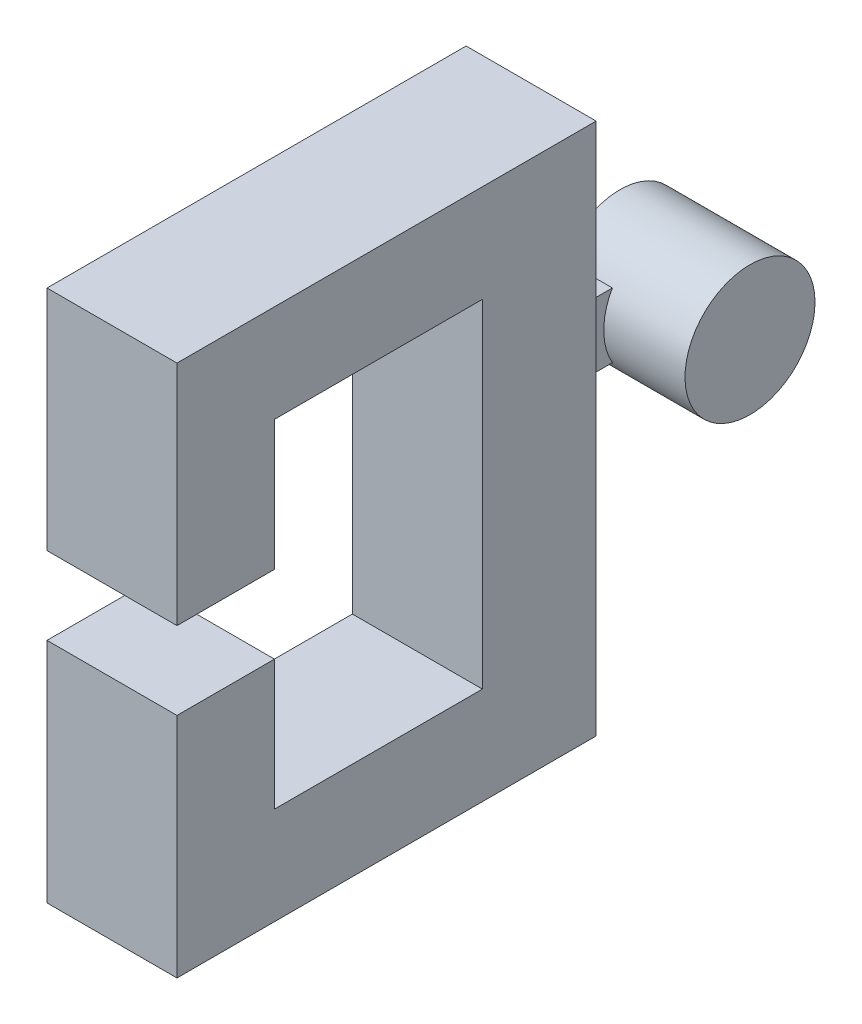
ISO-10303-21;
HEADER;
FILE_DESCRIPTION(('STEP AP214'),'2;1');
FILE_NAME('part.step','',(''),(''),'','','');
FILE_SCHEMA(('AUTOMOTIVE_DESIGN { 1 0 10303 214 1 1 1 1 }'));
ENDSEC;
DATA;
#1=APPLICATION_CONTEXT('core data for automotive mechanical design processes');
#2=APPLICATION_PROTOCOL_DEFINITION('international standard','automotive_design',2000,#1);
#3=PRODUCT_CONTEXT('',#1,'mechanical');
#4=PRODUCT('Part','Part','',(#3));
#5=PRODUCT_RELATED_PRODUCT_CATEGORY('part','',(#4));
#6=PRODUCT_DEFINITION_FORMATION('','',#4);
#7=PRODUCT_DEFINITION_CONTEXT('part definition',#1,'design');
#8=PRODUCT_DEFINITION('design','',#6,#7);
#9=PRODUCT_DEFINITION_SHAPE('','',#8);
#10=(LENGTH_UNIT() NAMED_UNIT(*) SI_UNIT(.MILLI.,.METRE.));
#11=(NAMED_UNIT(*) PLANE_ANGLE_UNIT() SI_UNIT($,.RADIAN.));
#12=(NAMED_UNIT(*) SI_UNIT($,.STERADIAN.) SOLID_ANGLE_UNIT());
#13=UNCERTAINTY_MEASURE_WITH_UNIT(LENGTH_MEASURE(1.E-05),#10,'distance_accuracy_value','');
#14=(GEOMETRIC_REPRESENTATION_CONTEXT(3) GLOBAL_UNCERTAINTY_ASSIGNED_CONTEXT((#13)) GLOBAL_UNIT_ASSIGNED_CONTEXT((#10,
#11,#12)) REPRESENTATION_CONTEXT('',''));
#15=CARTESIAN_POINT('',(0.,0.,0.));
#16=DIRECTION('',(0.,0.,1.));
#17=DIRECTION('',(1.,0.,0.));
#18=AXIS2_PLACEMENT_3D('',#15,#16,#17);
#19=CARTESIAN_POINT('',(25.4,45.69968,-81.8896));
#20=DIRECTION('',(0.,1.,0.));
#21=DIRECTION('',(0.,0.,1.));
#22=AXIS2_PLACEMENT_3D('',#19,#20,#21);
#23=PLANE('',#22);
#24=DIRECTION('',(0.,0.,-1.));
#25=VECTOR('',#24,1.);
#26=CARTESIAN_POINT('',(9.525,45.69968,-100.9396));
#27=LINE('',#26,#25);
#28=CARTESIAN_POINT('',(9.525,45.69968,-81.8896));
#29=VERTEX_POINT('',#28);
#30=CARTESIAN_POINT('',(9.525,45.69968,-100.9396));
#31=VERTEX_POINT('',#30);
#32=EDGE_CURVE('E288',#29,#31,#27,.T.);
#33=ORIENTED_EDGE('',*,*,#32,.F.);
#34=DIRECTION('',(-1.,0.,0.));
#35=VECTOR('',#34,1.);
#36=CARTESIAN_POINT('',(25.4,45.69968,-81.8896));
#37=LINE('',#36,#35);
#38=CARTESIAN_POINT('',(0.,45.69968,-81.8896));
#39=VERTEX_POINT('',#38);
#40=EDGE_CURVE('E55',#29,#39,#37,.T.);
#41=ORIENTED_EDGE('',*,*,#40,.T.);
#42=DIRECTION('',(0.,0.,-1.));
#43=VECTOR('',#42,1.);
#44=CARTESIAN_POINT('',(0.,45.69968,-81.8896));
#45=LINE('',#44,#43);
#46=CARTESIAN_POINT('',(0.,45.69968,-100.9396));
#47=VERTEX_POINT('',#46);
#48=EDGE_CURVE('E195',#39,#47,#45,.T.);
#49=ORIENTED_EDGE('',*,*,#48,.T.);
#50=DIRECTION('',(-1.,0.,0.));
#51=VECTOR('',#50,1.);
#52=CARTESIAN_POINT('',(25.4,45.69968,-100.9396));
#53=LINE('',#52,#51);
#54=EDGE_CURVE('E278',#31,#47,#53,.T.);
#55=ORIENTED_EDGE('',*,*,#54,.F.);
#56=EDGE_LOOP('',(#33,#41,#49,#55));
#57=FACE_BOUND('',#56,.T.);
#58=ADVANCED_FACE('F45',(#57),#23,.F.);
#59=CARTESIAN_POINT('',(25.4,58.34888,-100.9396));
#60=DIRECTION('',(0.,-1.,0.));
#61=DIRECTION('',(0.,0.,-1.));
#62=AXIS2_PLACEMENT_3D('',#59,#60,#61);
#63=PLANE('',#62);
#64=DIRECTION('',(0.,0.,1.));
#65=VECTOR('',#64,1.);
#66=CARTESIAN_POINT('',(9.525,58.34888,-81.8896));
#67=LINE('',#66,#65);
#68=CARTESIAN_POINT('',(9.525,58.34888,-100.9396));
#69=VERTEX_POINT('',#68);
#70=CARTESIAN_POINT('',(9.525,58.34888,-81.8896));
#71=VERTEX_POINT('',#70);
#72=EDGE_CURVE('E313',#69,#71,#67,.T.);
#73=ORIENTED_EDGE('',*,*,#72,.F.);
#74=DIRECTION('',(-1.,0.,0.));
#75=VECTOR('',#74,1.);
#76=CARTESIAN_POINT('',(25.4,58.34888,-100.9396));
#77=LINE('',#76,#75);
#78=CARTESIAN_POINT('',(0.,58.34888,-100.9396));
#79=VERTEX_POINT('',#78);
#80=EDGE_CURVE('E275',#69,#79,#77,.T.);
#81=ORIENTED_EDGE('',*,*,#80,.T.);
#82=DIRECTION('',(0.,0.,1.));
#83=VECTOR('',#82,1.);
#84=CARTESIAN_POINT('',(0.,58.34888,-100.9396));
#85=LINE('',#84,#83);
#86=CARTESIAN_POINT('',(0.,58.34888,-81.8896));
#87=VERTEX_POINT('',#86);
#88=EDGE_CURVE('E203',#79,#87,#85,.T.);
#89=ORIENTED_EDGE('',*,*,#88,.T.);
#90=DIRECTION('',(-1.,0.,0.));
#91=VECTOR('',#90,1.);
#92=CARTESIAN_POINT('',(25.4,58.34888,-81.8896));
#93=LINE('',#92,#91);
#94=EDGE_CURVE('E272',#71,#87,#93,.T.);
#95=ORIENTED_EDGE('',*,*,#94,.F.);
#96=EDGE_LOOP('',(#73,#81,#89,#95));
#97=FACE_BOUND('',#96,.T.);
#98=ADVANCED_FACE('F370',(#97),#63,.F.);
#99=CARTESIAN_POINT('',(25.4,52.02428,-111.952748271044));
#100=DIRECTION('',(1.,0.,0.));
#101=DIRECTION('',(0.,0.,-1.));
#102=AXIS2_PLACEMENT_3D('',#99,#100,#101);
#103=PLANE('',#102);
#104=DIRECTION('',(0.,1.,0.));
#105=VECTOR('',#104,1.);
#106=CARTESIAN_POINT('',(25.4,0.,-81.8896));
#107=LINE('',#106,#105);
#108=CARTESIAN_POINT('',(25.4,0.,-81.8896));
#109=VERTEX_POINT('',#108);
#110=CARTESIAN_POINT('',(25.4,104.04856,-81.8896));
#111=VERTEX_POINT('',#110);
#112=EDGE_CURVE('E131',#109,#111,#107,.T.);
#113=ORIENTED_EDGE('',*,*,#112,.T.);
#114=DIRECTION('',(0.,0.,1.));
#115=VECTOR('',#114,1.);
#116=CARTESIAN_POINT('',(25.4,104.04856,0.));
#117=LINE('',#116,#115);
#118=CARTESIAN_POINT('',(25.4,104.04856,0.));
#119=VERTEX_POINT('',#118);
#120=EDGE_CURVE('E330',#111,#119,#117,.T.);
#121=ORIENTED_EDGE('',*,*,#120,.T.);
#122=DIRECTION('',(0.,-1.,0.));
#123=VECTOR('',#122,1.);
#124=CARTESIAN_POINT('',(25.4,59.61888,0.));
#125=LINE('',#124,#123);
#126=CARTESIAN_POINT('',(25.4,59.61888,0.));
#127=VERTEX_POINT('',#126);
#128=EDGE_CURVE('E333',#119,#127,#125,.T.);
#129=ORIENTED_EDGE('',*,*,#128,.T.);
#130=DIRECTION('',(0.,0.,-1.));
#131=VECTOR('',#130,1.);
#132=CARTESIAN_POINT('',(25.4,59.61888,-19.05));
#133=LINE('',#132,#131);
#134=CARTESIAN_POINT('',(25.4,59.61888,-19.05));
#135=VERTEX_POINT('',#134);
#136=EDGE_CURVE('E336',#127,#135,#133,.T.);
#137=ORIENTED_EDGE('',*,*,#136,.T.);
#138=DIRECTION('',(0.,1.,0.));
#139=VECTOR('',#138,1.);
#140=CARTESIAN_POINT('',(25.4,84.9985600000001,-19.05));
#141=LINE('',#140,#139);
#142=CARTESIAN_POINT('',(25.4,84.9985600000001,-19.05));
#143=VERTEX_POINT('',#142);
#144=EDGE_CURVE('E339',#135,#143,#141,.T.);
#145=ORIENTED_EDGE('',*,*,#144,.T.);
#146=DIRECTION('',(0.,0.,-1.));
#147=VECTOR('',#146,1.);
#148=CARTESIAN_POINT('',(25.4,84.9985600000001,-59.6646));
#149=LINE('',#148,#147);
#150=CARTESIAN_POINT('',(25.4,84.9985600000001,-59.6646));
#151=VERTEX_POINT('',#150);
#152=EDGE_CURVE('E342',#143,#151,#149,.T.);
#153=ORIENTED_EDGE('',*,*,#152,.T.);
#154=DIRECTION('',(0.,-1.,0.));
#155=VECTOR('',#154,1.);
#156=CARTESIAN_POINT('',(25.4,19.05,-59.6646));
#157=LINE('',#156,#155);
#158=CARTESIAN_POINT('',(25.4,19.05,-59.6646));
#159=VERTEX_POINT('',#158);
#160=EDGE_CURVE('E345',#151,#159,#157,.T.);
#161=ORIENTED_EDGE('',*,*,#160,.T.);
#162=DIRECTION('',(0.,0.,1.));
#163=VECTOR('',#162,1.);
#164=CARTESIAN_POINT('',(25.4,19.05,-19.05));
#165=LINE('',#164,#163);
#166=CARTESIAN_POINT('',(25.4,19.05,-19.05));
#167=VERTEX_POINT('',#166);
#168=EDGE_CURVE('E164',#159,#167,#165,.T.);
#169=ORIENTED_EDGE('',*,*,#168,.T.);
#170=DIRECTION('',(0.,1.,0.));
#171=VECTOR('',#170,1.);
#172=CARTESIAN_POINT('',(25.4,44.42968,-19.05));
#173=LINE('',#172,#171);
#174=CARTESIAN_POINT('',(25.4,44.42968,-19.05));
#175=VERTEX_POINT('',#174);
#176=EDGE_CURVE('E158',#167,#175,#173,.T.);
#177=ORIENTED_EDGE('',*,*,#176,.T.);
#178=DIRECTION('',(0.,0.,1.));
#179=VECTOR('',#178,1.);
#180=CARTESIAN_POINT('',(25.4,44.42968,0.));
#181=LINE('',#180,#179);
#182=CARTESIAN_POINT('',(25.4,44.42968,0.));
#183=VERTEX_POINT('',#182);
#184=EDGE_CURVE('E162',#175,#183,#181,.T.);
#185=ORIENTED_EDGE('',*,*,#184,.T.);
#186=DIRECTION('',(0.,-1.,0.));
#187=VECTOR('',#186,1.);
#188=CARTESIAN_POINT('',(25.4,0.,0.));
#189=LINE('',#188,#187);
#190=CARTESIAN_POINT('',(25.4,0.,0.));
#191=VERTEX_POINT('',#190);
#192=EDGE_CURVE('E63',#183,#191,#189,.T.);
#193=ORIENTED_EDGE('',*,*,#192,.T.);
#194=DIRECTION('',(0.,0.,-1.));
#195=VECTOR('',#194,1.);
#196=CARTESIAN_POINT('',(25.4,0.,0.));
#197=LINE('',#196,#195);
#198=EDGE_CURVE('E237',#191,#109,#197,.T.);
#199=ORIENTED_EDGE('',*,*,#198,.T.);
#200=EDGE_LOOP('',(#113,#121,#129,#137,#145,#153,#161,#169,#177,#185,#193,#199));
#201=FACE_BOUND('',#200,.T.);
#202=ADVANCED_FACE('F160',(#201),#103,.T.);
#203=CARTESIAN_POINT('',(25.4,52.02428,-111.952748271044));
#204=DIRECTION('',(1.,0.,0.));
#205=DIRECTION('',(0.,0.,-1.));
#206=AXIS2_PLACEMENT_3D('',#203,#204,#205);
#207=CIRCLE('',#206,12.7);
#208=CARTESIAN_POINT('',(25.4,52.02428,-124.652748271044));
#209=VERTEX_POINT('',#208);
#210=EDGE_CURVE('E326',#209,#209,#207,.T.);
#211=ORIENTED_EDGE('',*,*,#210,.T.);
#212=EDGE_LOOP('',(#211));
#213=FACE_BOUND('',#212,.T.);
#214=ADVANCED_FACE('F431',(#213),#103,.T.);
#215=CARTESIAN_POINT('',(25.4,0.,0.));
#216=DIRECTION('',(0.,1.,0.));
#217=DIRECTION('',(0.,0.,1.));
#218=AXIS2_PLACEMENT_3D('',#215,#216,#217);
#219=PLANE('',#218);
#220=DIRECTION('',(0.,0.,-1.));
#221=VECTOR('',#220,1.);
#222=CARTESIAN_POINT('',(0.,0.,0.));
#223=LINE('',#222,#221);
#224=CARTESIAN_POINT('',(0.,0.,0.));
#225=VERTEX_POINT('',#224);
#226=CARTESIAN_POINT('',(0.,0.,-81.8896));
#227=VERTEX_POINT('',#226);
#228=EDGE_CURVE('E186',#225,#227,#223,.T.);
#229=ORIENTED_EDGE('',*,*,#228,.T.);
#230=DIRECTION('',(-1.,0.,0.));
#231=VECTOR('',#230,1.);
#232=CARTESIAN_POINT('',(25.4,0.,-81.8896));
#233=LINE('',#232,#231);
#234=EDGE_CURVE('E11',#109,#227,#233,.T.);
#235=ORIENTED_EDGE('',*,*,#234,.F.);
#236=ORIENTED_EDGE('',*,*,#198,.F.);
#237=DIRECTION('',(-1.,0.,0.));
#238=VECTOR('',#237,1.);
#239=CARTESIAN_POINT('',(25.4,0.,0.));
#240=LINE('',#239,#238);
#241=EDGE_CURVE('E182',#191,#225,#240,.T.);
#242=ORIENTED_EDGE('',*,*,#241,.T.);
#243=EDGE_LOOP('',(#229,#235,#236,#242));
#244=FACE_BOUND('',#243,.T.);
#245=ADVANCED_FACE('F47',(#244),#219,.F.);
#246=CARTESIAN_POINT('',(25.4,52.02428,-111.952748271044));
#247=DIRECTION('',(-1.,0.,0.));
#248=DIRECTION('',(0.,0.,1.));
#249=AXIS2_PLACEMENT_3D('',#246,#247,#248);
#250=CYLINDRICAL_SURFACE('',#249,12.7);
#251=CARTESIAN_POINT('',(9.525,52.02428,-111.952748271044));
#252=DIRECTION('',(-1.,0.,0.));
#253=DIRECTION('',(0.,0.,-1.));
#254=AXIS2_PLACEMENT_3D('',#251,#252,#253);
#255=CIRCLE('',#254,12.7);
#256=EDGE_CURVE('E305',#31,#69,#255,.T.);
#257=ORIENTED_EDGE('',*,*,#256,.F.);
#258=ORIENTED_EDGE('',*,*,#54,.T.);
#259=CARTESIAN_POINT('',(0.,52.02428,-111.952748271044));
#260=DIRECTION('',(1.,0.,0.));
#261=DIRECTION('',(0.,0.,-1.));
#262=AXIS2_PLACEMENT_3D('',#259,#260,#261);
#263=CIRCLE('',#262,12.7);
#264=EDGE_CURVE('E199',#47,#79,#263,.T.);
#265=ORIENTED_EDGE('',*,*,#264,.T.);
#266=ORIENTED_EDGE('',*,*,#80,.F.);
#267=EDGE_LOOP('',(#257,#258,#265,#266));
#268=FACE_BOUND('',#267,.T.);
#269=ORIENTED_EDGE('',*,*,#210,.F.);
#270=EDGE_LOOP('',(#269));
#271=FACE_BOUND('',#270,.T.);
#272=ADVANCED_FACE('F300',(#268,#271),#250,.T.);
#273=CARTESIAN_POINT('',(25.4,58.34888,-81.8896));
#274=DIRECTION('',(0.,0.,1.));
#275=DIRECTION('',(1.,0.,0.));
#276=AXIS2_PLACEMENT_3D('',#273,#274,#275);
#277=PLANE('',#276);
#278=DIRECTION('',(0.,1.,0.));
#279=VECTOR('',#278,1.);
#280=CARTESIAN_POINT('',(0.,58.34888,-81.8896));
#281=LINE('',#280,#279);
#282=CARTESIAN_POINT('',(0.,104.04856,-81.8896));
#283=VERTEX_POINT('',#282);
#284=EDGE_CURVE('E207',#87,#283,#281,.T.);
#285=ORIENTED_EDGE('',*,*,#284,.T.);
#286=DIRECTION('',(-1.,0.,0.));
#287=VECTOR('',#286,1.);
#288=CARTESIAN_POINT('',(25.4,104.04856,-81.8896));
#289=LINE('',#288,#287);
#290=EDGE_CURVE('E268',#111,#283,#289,.T.);
#291=ORIENTED_EDGE('',*,*,#290,.F.);
#292=ORIENTED_EDGE('',*,*,#112,.F.);
#293=ORIENTED_EDGE('',*,*,#234,.T.);
#294=DIRECTION('',(0.,1.,0.));
#295=VECTOR('',#294,1.);
#296=CARTESIAN_POINT('',(0.,0.,-81.8896));
#297=LINE('',#296,#295);
#298=EDGE_CURVE('E190',#227,#39,#297,.T.);
#299=ORIENTED_EDGE('',*,*,#298,.T.);
#300=ORIENTED_EDGE('',*,*,#40,.F.);
#301=DIRECTION('',(0.,-1.,0.));
#302=VECTOR('',#301,1.);
#303=CARTESIAN_POINT('',(9.525,45.69968,-81.8896));
#304=LINE('',#303,#302);
#305=EDGE_CURVE('E191',#71,#29,#304,.T.);
#306=ORIENTED_EDGE('',*,*,#305,.F.);
#307=ORIENTED_EDGE('',*,*,#94,.T.);
#308=EDGE_LOOP('',(#285,#291,#292,#293,#299,#300,#306,#307));
#309=FACE_BOUND('',#308,.T.);
#310=ADVANCED_FACE('F290',(#309),#277,.F.);
#311=CARTESIAN_POINT('',(25.4,104.04856,0.));
#312=DIRECTION('',(0.,-1.,0.));
#313=DIRECTION('',(0.,0.,-1.));
#314=AXIS2_PLACEMENT_3D('',#311,#312,#313);
#315=PLANE('',#314);
#316=DIRECTION('',(0.,0.,1.));
#317=VECTOR('',#316,1.);
#318=CARTESIAN_POINT('',(0.,104.04856,0.));
#319=LINE('',#318,#317);
#320=CARTESIAN_POINT('',(0.,104.04856,0.));
#321=VERTEX_POINT('',#320);
#322=EDGE_CURVE('E210',#283,#321,#319,.T.);
#323=ORIENTED_EDGE('',*,*,#322,.T.);
#324=DIRECTION('',(-1.,0.,0.));
#325=VECTOR('',#324,1.);
#326=CARTESIAN_POINT('',(25.4,104.04856,0.));
#327=LINE('',#326,#325);
#328=EDGE_CURVE('E264',#119,#321,#327,.T.);
#329=ORIENTED_EDGE('',*,*,#328,.F.);
#330=ORIENTED_EDGE('',*,*,#120,.F.);
#331=ORIENTED_EDGE('',*,*,#290,.T.);
#332=EDGE_LOOP('',(#323,#329,#330,#331));
#333=FACE_BOUND('',#332,.T.);
#334=ADVANCED_FACE('F381',(#333),#315,.F.);
#335=CARTESIAN_POINT('',(25.4,59.61888,0.));
#336=DIRECTION('',(0.,0.,-1.));
#337=DIRECTION('',(-1.,0.,0.));
#338=AXIS2_PLACEMENT_3D('',#335,#336,#337);
#339=PLANE('',#338);
#340=DIRECTION('',(0.,-1.,0.));
#341=VECTOR('',#340,1.);
#342=CARTESIAN_POINT('',(0.,59.61888,0.));
#343=LINE('',#342,#341);
#344=CARTESIAN_POINT('',(0.,59.61888,0.));
#345=VERTEX_POINT('',#344);
#346=EDGE_CURVE('E213',#321,#345,#343,.T.);
#347=ORIENTED_EDGE('',*,*,#346,.T.);
#348=DIRECTION('',(-1.,0.,0.));
#349=VECTOR('',#348,1.);
#350=CARTESIAN_POINT('',(25.4,59.61888,0.));
#351=LINE('',#350,#349);
#352=EDGE_CURVE('E260',#127,#345,#351,.T.);
#353=ORIENTED_EDGE('',*,*,#352,.F.);
#354=ORIENTED_EDGE('',*,*,#128,.F.);
#355=ORIENTED_EDGE('',*,*,#328,.T.);
#356=EDGE_LOOP('',(#347,#353,#354,#355));
#357=FACE_BOUND('',#356,.T.);
#358=ADVANCED_FACE('F384',(#357),#339,.F.);
#359=CARTESIAN_POINT('',(25.4,59.61888,-19.05));
#360=DIRECTION('',(0.,1.,0.));
#361=DIRECTION('',(0.,0.,1.));
#362=AXIS2_PLACEMENT_3D('',#359,#360,#361);
#363=PLANE('',#362);
#364=DIRECTION('',(0.,0.,-1.));
#365=VECTOR('',#364,1.);
#366=CARTESIAN_POINT('',(0.,59.61888,-19.05));
#367=LINE('',#366,#365);
#368=CARTESIAN_POINT('',(0.,59.61888,-19.05));
#369=VERTEX_POINT('',#368);
#370=EDGE_CURVE('E216',#345,#369,#367,.T.);
#371=ORIENTED_EDGE('',*,*,#370,.T.);
#372=DIRECTION('',(-1.,0.,0.));
#373=VECTOR('',#372,1.);
#374=CARTESIAN_POINT('',(25.4,59.61888,-19.05));
#375=LINE('',#374,#373);
#376=EDGE_CURVE('E256',#135,#369,#375,.T.);
#377=ORIENTED_EDGE('',*,*,#376,.F.);
#378=ORIENTED_EDGE('',*,*,#136,.F.);
#379=ORIENTED_EDGE('',*,*,#352,.T.);
#380=EDGE_LOOP('',(#371,#377,#378,#379));
#381=FACE_BOUND('',#380,.T.);
#382=ADVANCED_FACE('F388',(#381),#363,.F.);
#383=CARTESIAN_POINT('',(25.4,84.9985600000001,-19.05));
#384=DIRECTION('',(0.,0.,1.));
#385=DIRECTION('',(0.,-1.,0.));
#386=AXIS2_PLACEMENT_3D('',#383,#384,#385);
#387=PLANE('',#386);
#388=DIRECTION('',(0.,1.,0.));
#389=VECTOR('',#388,1.);
#390=CARTESIAN_POINT('',(0.,84.9985600000001,-19.05));
#391=LINE('',#390,#389);
#392=CARTESIAN_POINT('',(0.,84.9985600000001,-19.05));
#393=VERTEX_POINT('',#392);
#394=EDGE_CURVE('E219',#369,#393,#391,.T.);
#395=ORIENTED_EDGE('',*,*,#394,.T.);
#396=DIRECTION('',(-1.,0.,0.));
#397=VECTOR('',#396,1.);
#398=CARTESIAN_POINT('',(25.4,84.9985600000001,-19.05));
#399=LINE('',#398,#397);
#400=EDGE_CURVE('E252',#143,#393,#399,.T.);
#401=ORIENTED_EDGE('',*,*,#400,.F.);
#402=ORIENTED_EDGE('',*,*,#144,.F.);
#403=ORIENTED_EDGE('',*,*,#376,.T.);
#404=EDGE_LOOP('',(#395,#401,#402,#403));
#405=FACE_BOUND('',#404,.T.);
#406=ADVANCED_FACE('F392',(#405),#387,.F.);
#407=CARTESIAN_POINT('',(25.4,84.9985600000001,-59.6646));
#408=DIRECTION('',(0.,1.,0.));
#409=DIRECTION('',(0.,0.,1.));
#410=AXIS2_PLACEMENT_3D('',#407,#408,#409);
#411=PLANE('',#410);
#412=DIRECTION('',(0.,0.,-1.));
#413=VECTOR('',#412,1.);
#414=CARTESIAN_POINT('',(0.,84.9985600000001,-59.6646));
#415=LINE('',#414,#413);
#416=CARTESIAN_POINT('',(0.,84.9985600000001,-59.6646));
#417=VERTEX_POINT('',#416);
#418=EDGE_CURVE('E222',#393,#417,#415,.T.);
#419=ORIENTED_EDGE('',*,*,#418,.T.);
#420=DIRECTION('',(-1.,0.,0.));
#421=VECTOR('',#420,1.);
#422=CARTESIAN_POINT('',(25.4,84.9985600000001,-59.6646));
#423=LINE('',#422,#421);
#424=EDGE_CURVE('E248',#151,#417,#423,.T.);
#425=ORIENTED_EDGE('',*,*,#424,.F.);
#426=ORIENTED_EDGE('',*,*,#152,.F.);
#427=ORIENTED_EDGE('',*,*,#400,.T.);
#428=EDGE_LOOP('',(#419,#425,#426,#427));
#429=FACE_BOUND('',#428,.T.);
#430=ADVANCED_FACE('F396',(#429),#411,.F.);
#431=CARTESIAN_POINT('',(25.4,19.05,-59.6646));
#432=DIRECTION('',(0.,0.,-1.));
#433=DIRECTION('',(-1.,0.,0.));
#434=AXIS2_PLACEMENT_3D('',#431,#432,#433);
#435=PLANE('',#434);
#436=DIRECTION('',(0.,-1.,0.));
#437=VECTOR('',#436,1.);
#438=CARTESIAN_POINT('',(0.,19.05,-59.6646));
#439=LINE('',#438,#437);
#440=CARTESIAN_POINT('',(0.,19.05,-59.6646));
#441=VERTEX_POINT('',#440);
#442=EDGE_CURVE('E225',#417,#441,#439,.T.);
#443=ORIENTED_EDGE('',*,*,#442,.T.);
#444=DIRECTION('',(-1.,0.,0.));
#445=VECTOR('',#444,1.);
#446=CARTESIAN_POINT('',(25.4,19.05,-59.6646));
#447=LINE('',#446,#445);
#448=EDGE_CURVE('E244',#159,#441,#447,.T.);
#449=ORIENTED_EDGE('',*,*,#448,.F.);
#450=ORIENTED_EDGE('',*,*,#160,.F.);
#451=ORIENTED_EDGE('',*,*,#424,.T.);
#452=EDGE_LOOP('',(#443,#449,#450,#451));
#453=FACE_BOUND('',#452,.T.);
#454=ADVANCED_FACE('F353',(#453),#435,.F.);
#455=CARTESIAN_POINT('',(25.4,19.05,-19.05));
#456=DIRECTION('',(0.,-1.,0.));
#457=DIRECTION('',(0.,0.,-1.));
#458=AXIS2_PLACEMENT_3D('',#455,#456,#457);
#459=PLANE('',#458);
#460=DIRECTION('',(0.,0.,1.));
#461=VECTOR('',#460,1.);
#462=CARTESIAN_POINT('',(0.,19.05,-19.05));
#463=LINE('',#462,#461);
#464=CARTESIAN_POINT('',(0.,19.05,-19.05));
#465=VERTEX_POINT('',#464);
#466=EDGE_CURVE('E228',#441,#465,#463,.T.);
#467=ORIENTED_EDGE('',*,*,#466,.T.);
#468=DIRECTION('',(-1.,0.,0.));
#469=VECTOR('',#468,1.);
#470=CARTESIAN_POINT('',(25.4,19.05,-19.05));
#471=LINE('',#470,#469);
#472=EDGE_CURVE('E175',#167,#465,#471,.T.);
#473=ORIENTED_EDGE('',*,*,#472,.F.);
#474=ORIENTED_EDGE('',*,*,#168,.F.);
#475=ORIENTED_EDGE('',*,*,#448,.T.);
#476=EDGE_LOOP('',(#467,#473,#474,#475));
#477=FACE_BOUND('',#476,.T.);
#478=ADVANCED_FACE('F357',(#477),#459,.F.);
#479=CARTESIAN_POINT('',(25.4,44.42968,-19.05));
#480=DIRECTION('',(0.,0.,1.));
#481=DIRECTION('',(0.,-1.,0.));
#482=AXIS2_PLACEMENT_3D('',#479,#480,#481);
#483=PLANE('',#482);
#484=DIRECTION('',(0.,1.,0.));
#485=VECTOR('',#484,1.);
#486=CARTESIAN_POINT('',(0.,44.42968,-19.05));
#487=LINE('',#486,#485);
#488=CARTESIAN_POINT('',(0.,44.42968,-19.05));
#489=VERTEX_POINT('',#488);
#490=EDGE_CURVE('E173',#465,#489,#487,.T.);
#491=ORIENTED_EDGE('',*,*,#490,.T.);
#492=DIRECTION('',(-1.,0.,0.));
#493=VECTOR('',#492,1.);
#494=CARTESIAN_POINT('',(25.4,44.42968,-19.05));
#495=LINE('',#494,#493);
#496=EDGE_CURVE('E170',#175,#489,#495,.T.);
#497=ORIENTED_EDGE('',*,*,#496,.F.);
#498=ORIENTED_EDGE('',*,*,#176,.F.);
#499=ORIENTED_EDGE('',*,*,#472,.T.);
#500=EDGE_LOOP('',(#491,#497,#498,#499));
#501=FACE_BOUND('',#500,.T.);
#502=ADVANCED_FACE('F171',(#501),#483,.F.);
#503=CARTESIAN_POINT('',(25.4,44.42968,0.));
#504=DIRECTION('',(0.,-1.,0.));
#505=DIRECTION('',(0.,0.,-1.));
#506=AXIS2_PLACEMENT_3D('',#503,#504,#505);
#507=PLANE('',#506);
#508=DIRECTION('',(0.,0.,1.));
#509=VECTOR('',#508,1.);
#510=CARTESIAN_POINT('',(0.,44.42968,0.));
#511=LINE('',#510,#509);
#512=CARTESIAN_POINT('',(0.,44.42968,0.));
#513=VERTEX_POINT('',#512);
#514=EDGE_CURVE('E117',#489,#513,#511,.T.);
#515=ORIENTED_EDGE('',*,*,#514,.T.);
#516=DIRECTION('',(-1.,0.,0.));
#517=VECTOR('',#516,1.);
#518=CARTESIAN_POINT('',(25.4,44.42968,0.));
#519=LINE('',#518,#517);
#520=EDGE_CURVE('E176',#183,#513,#519,.T.);
#521=ORIENTED_EDGE('',*,*,#520,.F.);
#522=ORIENTED_EDGE('',*,*,#184,.F.);
#523=ORIENTED_EDGE('',*,*,#496,.T.);
#524=EDGE_LOOP('',(#515,#521,#522,#523));
#525=FACE_BOUND('',#524,.T.);
#526=ADVANCED_FACE('F178',(#525),#507,.F.);
#527=CARTESIAN_POINT('',(25.4,0.,0.));
#528=DIRECTION('',(0.,0.,-1.));
#529=DIRECTION('',(-1.,0.,0.));
#530=AXIS2_PLACEMENT_3D('',#527,#528,#529);
#531=PLANE('',#530);
#532=DIRECTION('',(0.,-1.,0.));
#533=VECTOR('',#532,1.);
#534=CARTESIAN_POINT('',(0.,0.,0.));
#535=LINE('',#534,#533);
#536=EDGE_CURVE('E123',#513,#225,#535,.T.);
#537=ORIENTED_EDGE('',*,*,#536,.T.);
#538=ORIENTED_EDGE('',*,*,#241,.F.);
#539=ORIENTED_EDGE('',*,*,#192,.F.);
#540=ORIENTED_EDGE('',*,*,#520,.T.);
#541=EDGE_LOOP('',(#537,#538,#539,#540));
#542=FACE_BOUND('',#541,.T.);
#543=ADVANCED_FACE('F360',(#542),#531,.F.);
#544=CARTESIAN_POINT('',(0.,52.02428,-111.952748271044));
#545=DIRECTION('',(1.,0.,0.));
#546=DIRECTION('',(0.,0.,-1.));
#547=AXIS2_PLACEMENT_3D('',#544,#545,#546);
#548=PLANE('',#547);
#549=ORIENTED_EDGE('',*,*,#228,.F.);
#550=ORIENTED_EDGE('',*,*,#536,.F.);
#551=ORIENTED_EDGE('',*,*,#514,.F.);
#552=ORIENTED_EDGE('',*,*,#490,.F.);
#553=ORIENTED_EDGE('',*,*,#466,.F.);
#554=ORIENTED_EDGE('',*,*,#442,.F.);
#555=ORIENTED_EDGE('',*,*,#418,.F.);
#556=ORIENTED_EDGE('',*,*,#394,.F.);
#557=ORIENTED_EDGE('',*,*,#370,.F.);
#558=ORIENTED_EDGE('',*,*,#346,.F.);
#559=ORIENTED_EDGE('',*,*,#322,.F.);
#560=ORIENTED_EDGE('',*,*,#284,.F.);
#561=ORIENTED_EDGE('',*,*,#88,.F.);
#562=ORIENTED_EDGE('',*,*,#264,.F.);
#563=ORIENTED_EDGE('',*,*,#48,.F.);
#564=ORIENTED_EDGE('',*,*,#298,.F.);
#565=EDGE_LOOP('',(#549,#550,#551,#552,#553,#554,#555,#556,#557,#558,#559,#560,#561,#562,#563,#564));
#566=FACE_BOUND('',#565,.T.);
#567=ADVANCED_FACE('F294',(#566),#548,.F.);
#568=CARTESIAN_POINT('',(9.525,52.02428,-111.952748271044));
#569=DIRECTION('',(1.,0.,0.));
#570=DIRECTION('',(0.,0.,-1.));
#571=AXIS2_PLACEMENT_3D('',#568,#569,#570);
#572=PLANE('',#571);
#573=ORIENTED_EDGE('',*,*,#32,.T.);
#574=ORIENTED_EDGE('',*,*,#256,.T.);
#575=ORIENTED_EDGE('',*,*,#72,.T.);
#576=ORIENTED_EDGE('',*,*,#305,.T.);
#577=EDGE_LOOP('',(#573,#574,#575,#576));
#578=FACE_BOUND('',#577,.T.);
#579=ADVANCED_FACE('F314',(#578),#572,.T.);
#580=CLOSED_SHELL('',(#58,#98,#202,#214,#245,#272,#310,#334,#358,#382,#406,#430,#454,#478,#502,
#526,#543,#567,#579));
#581=MANIFOLD_SOLID_BREP('B2',#580);
#582=ADVANCED_BREP_SHAPE_REPRESENTATION('',(#18,#581),#14);
#583=SHAPE_DEFINITION_REPRESENTATION(#9,#582);
ENDSEC;
END-ISO-10303-21;
